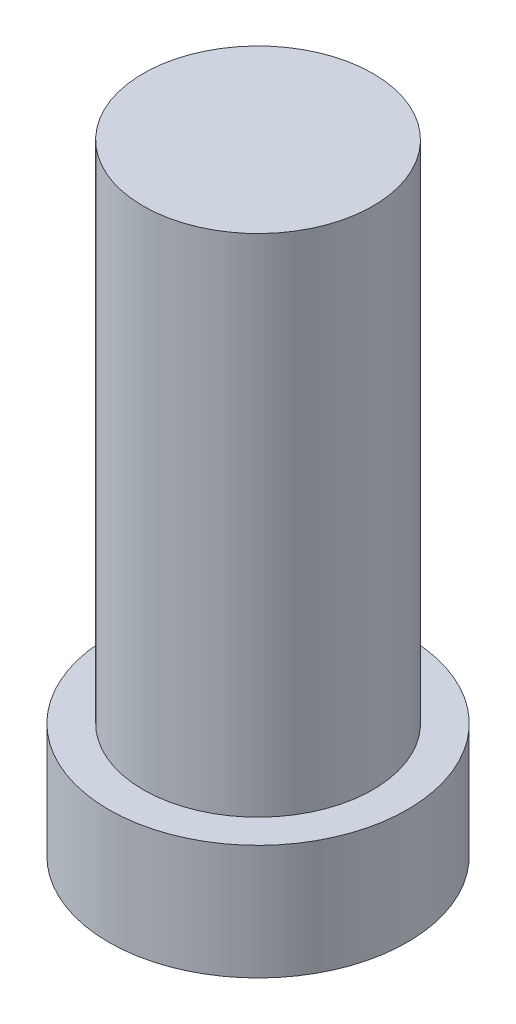
ISO-10303-21;
HEADER;
FILE_DESCRIPTION(('STEP AP214'),'2;1');
FILE_NAME('part.step','',(''),(''),'','','');
FILE_SCHEMA(('AUTOMOTIVE_DESIGN { 1 0 10303 214 1 1 1 1 }'));
ENDSEC;
DATA;
#1=APPLICATION_CONTEXT('core data for automotive mechanical design processes');
#2=APPLICATION_PROTOCOL_DEFINITION('international standard','automotive_design',2000,#1);
#3=PRODUCT_CONTEXT('',#1,'mechanical');
#4=PRODUCT('Part','Part','',(#3));
#5=PRODUCT_RELATED_PRODUCT_CATEGORY('part','',(#4));
#6=PRODUCT_DEFINITION_FORMATION('','',#4);
#7=PRODUCT_DEFINITION_CONTEXT('part definition',#1,'design');
#8=PRODUCT_DEFINITION('design','',#6,#7);
#9=PRODUCT_DEFINITION_SHAPE('','',#8);
#10=(LENGTH_UNIT() NAMED_UNIT(*) SI_UNIT(.MILLI.,.METRE.));
#11=(NAMED_UNIT(*) PLANE_ANGLE_UNIT() SI_UNIT($,.RADIAN.));
#12=(NAMED_UNIT(*) SI_UNIT($,.STERADIAN.) SOLID_ANGLE_UNIT());
#13=UNCERTAINTY_MEASURE_WITH_UNIT(LENGTH_MEASURE(1.E-05),#10,'distance_accuracy_value','');
#14=(GEOMETRIC_REPRESENTATION_CONTEXT(3) GLOBAL_UNCERTAINTY_ASSIGNED_CONTEXT((#13)) GLOBAL_UNIT_ASSIGNED_CONTEXT((#10,
#11,#12)) REPRESENTATION_CONTEXT('',''));
#15=CARTESIAN_POINT('',(0.,0.,0.));
#16=DIRECTION('',(0.,0.,1.));
#17=DIRECTION('',(1.,0.,0.));
#18=AXIS2_PLACEMENT_3D('',#15,#16,#17);
#19=CARTESIAN_POINT('',(0.,5.,0.));
#20=DIRECTION('',(0.,-1.,0.));
#21=DIRECTION('',(0.,0.,-1.));
#22=AXIS2_PLACEMENT_3D('',#19,#20,#21);
#23=CYLINDRICAL_SURFACE('',#22,6.5);
#24=CARTESIAN_POINT('',(0.,5.,0.));
#25=DIRECTION('',(0.,1.,0.));
#26=DIRECTION('',(0.,0.,1.));
#27=AXIS2_PLACEMENT_3D('',#24,#25,#26);
#28=CIRCLE('',#27,6.5);
#29=CARTESIAN_POINT('',(0.,5.,6.5));
#30=VERTEX_POINT('',#29);
#31=EDGE_CURVE('E49',#30,#30,#28,.T.);
#32=ORIENTED_EDGE('',*,*,#31,.F.);
#33=EDGE_LOOP('',(#32));
#34=FACE_BOUND('',#33,.T.);
#35=CARTESIAN_POINT('',(0.,0.,0.));
#36=DIRECTION('',(0.,1.,0.));
#37=DIRECTION('',(0.,0.,1.));
#38=AXIS2_PLACEMENT_3D('',#35,#36,#37);
#39=CIRCLE('',#38,6.5);
#40=CARTESIAN_POINT('',(0.,0.,6.5));
#41=VERTEX_POINT('',#40);
#42=EDGE_CURVE('E44',#41,#41,#39,.T.);
#43=ORIENTED_EDGE('',*,*,#42,.T.);
#44=EDGE_LOOP('',(#43));
#45=FACE_BOUND('',#44,.T.);
#46=ADVANCED_FACE('F41',(#34,#45),#23,.T.);
#47=CARTESIAN_POINT('',(0.,5.,0.));
#48=DIRECTION('',(0.,1.,0.));
#49=DIRECTION('',(0.,0.,1.));
#50=AXIS2_PLACEMENT_3D('',#47,#48,#49);
#51=PLANE('',#50);
#52=CARTESIAN_POINT('',(0.,5.,0.));
#53=DIRECTION('',(0.,1.,0.));
#54=DIRECTION('',(0.,0.,1.));
#55=AXIS2_PLACEMENT_3D('',#52,#53,#54);
#56=CIRCLE('',#55,5.);
#57=CARTESIAN_POINT('',(0.,5.,5.));
#58=VERTEX_POINT('',#57);
#59=EDGE_CURVE('E11',#58,#58,#56,.T.);
#60=ORIENTED_EDGE('',*,*,#59,.F.);
#61=EDGE_LOOP('',(#60));
#62=FACE_BOUND('',#61,.T.);
#63=ORIENTED_EDGE('',*,*,#31,.T.);
#64=EDGE_LOOP('',(#63));
#65=FACE_BOUND('',#64,.T.);
#66=ADVANCED_FACE('F132',(#62,#65),#51,.T.);
#67=CARTESIAN_POINT('',(0.,0.,0.));
#68=DIRECTION('',(0.,1.,0.));
#69=DIRECTION('',(0.,0.,1.));
#70=AXIS2_PLACEMENT_3D('',#67,#68,#69);
#71=PLANE('',#70);
#72=DIRECTION('',(-1.,0.,0.));
#73=VECTOR('',#72,1.);
#74=CARTESIAN_POINT('',(1.7667166355528,0.,5.1002659077454));
#75=LINE('',#74,#73);
#76=CARTESIAN_POINT('',(1.7667166355528,0.,5.1002659077454));
#77=VERTEX_POINT('',#76);
#78=CARTESIAN_POINT('',(-1.7667166355528,0.,5.1002659077454));
#79=VERTEX_POINT('',#78);
#80=EDGE_CURVE('E92',#77,#79,#75,.T.);
#81=ORIENTED_EDGE('',*,*,#80,.F.);
#82=DIRECTION('',(0.,0.,1.));
#83=VECTOR('',#82,1.);
#84=CARTESIAN_POINT('',(1.7667166355528,0.,-5.1002659077454));
#85=LINE('',#84,#83);
#86=CARTESIAN_POINT('',(1.7667166355528,0.,-5.1002659077454));
#87=VERTEX_POINT('',#86);
#88=EDGE_CURVE('E57',#87,#77,#85,.T.);
#89=ORIENTED_EDGE('',*,*,#88,.F.);
#90=DIRECTION('',(1.,0.,0.));
#91=VECTOR('',#90,1.);
#92=CARTESIAN_POINT('',(1.7667166355528,0.,-5.1002659077454));
#93=LINE('',#92,#91);
#94=CARTESIAN_POINT('',(-1.7667166355528,0.,-5.1002659077454));
#95=VERTEX_POINT('',#94);
#96=EDGE_CURVE('E108',#95,#87,#93,.T.);
#97=ORIENTED_EDGE('',*,*,#96,.F.);
#98=DIRECTION('',(0.,0.,-1.));
#99=VECTOR('',#98,1.);
#100=CARTESIAN_POINT('',(-1.7667166355528,0.,-5.1002659077454));
#101=LINE('',#100,#99);
#102=EDGE_CURVE('E114',#79,#95,#101,.T.);
#103=ORIENTED_EDGE('',*,*,#102,.F.);
#104=EDGE_LOOP('',(#81,#89,#97,#103));
#105=FACE_BOUND('',#104,.T.);
#106=ORIENTED_EDGE('',*,*,#42,.F.);
#107=EDGE_LOOP('',(#106));
#108=FACE_BOUND('',#107,.T.);
#109=ADVANCED_FACE('F129',(#105,#108),#71,.F.);
#110=CARTESIAN_POINT('',(0.,27.,0.));
#111=DIRECTION('',(0.,-1.,0.));
#112=DIRECTION('',(0.,0.,-1.));
#113=AXIS2_PLACEMENT_3D('',#110,#111,#112);
#114=CYLINDRICAL_SURFACE('',#113,5.);
#115=CARTESIAN_POINT('',(0.,27.,0.));
#116=DIRECTION('',(0.,1.,0.));
#117=DIRECTION('',(0.,0.,1.));
#118=AXIS2_PLACEMENT_3D('',#115,#116,#117);
#119=CIRCLE('',#118,5.);
#120=CARTESIAN_POINT('',(0.,27.,5.));
#121=VERTEX_POINT('',#120);
#122=EDGE_CURVE('E118',#121,#121,#119,.T.);
#123=ORIENTED_EDGE('',*,*,#122,.F.);
#124=EDGE_LOOP('',(#123));
#125=FACE_BOUND('',#124,.T.);
#126=ORIENTED_EDGE('',*,*,#59,.T.);
#127=EDGE_LOOP('',(#126));
#128=FACE_BOUND('',#127,.T.);
#129=ADVANCED_FACE('F131',(#125,#128),#114,.T.);
#130=CARTESIAN_POINT('',(0.,27.,0.));
#131=DIRECTION('',(0.,1.,0.));
#132=DIRECTION('',(0.,0.,1.));
#133=AXIS2_PLACEMENT_3D('',#130,#131,#132);
#134=PLANE('',#133);
#135=ORIENTED_EDGE('',*,*,#122,.T.);
#136=EDGE_LOOP('',(#135));
#137=FACE_BOUND('',#136,.T.);
#138=ADVANCED_FACE('F139',(#137),#134,.T.);
#139=CARTESIAN_POINT('',(1.7667166355528,3.,-5.1002659077454));
#140=DIRECTION('',(1.,0.,0.));
#141=DIRECTION('',(0.,0.,-1.));
#142=AXIS2_PLACEMENT_3D('',#139,#140,#141);
#143=PLANE('',#142);
#144=ORIENTED_EDGE('',*,*,#88,.T.);
#145=DIRECTION('',(0.,-1.,0.));
#146=VECTOR('',#145,1.);
#147=CARTESIAN_POINT('',(1.7667166355528,3.,5.1002659077454));
#148=LINE('',#147,#146);
#149=CARTESIAN_POINT('',(1.7667166355528,3.,5.1002659077454));
#150=VERTEX_POINT('',#149);
#151=EDGE_CURVE('E80',#150,#77,#148,.T.);
#152=ORIENTED_EDGE('',*,*,#151,.F.);
#153=DIRECTION('',(0.,0.,1.));
#154=VECTOR('',#153,1.);
#155=CARTESIAN_POINT('',(1.7667166355528,3.,-5.1002659077454));
#156=LINE('',#155,#154);
#157=CARTESIAN_POINT('',(1.7667166355528,3.,-5.1002659077454));
#158=VERTEX_POINT('',#157);
#159=EDGE_CURVE('E106',#158,#150,#156,.T.);
#160=ORIENTED_EDGE('',*,*,#159,.F.);
#161=DIRECTION('',(0.,-1.,0.));
#162=VECTOR('',#161,1.);
#163=CARTESIAN_POINT('',(1.7667166355528,3.,-5.1002659077454));
#164=LINE('',#163,#162);
#165=EDGE_CURVE('E65',#158,#87,#164,.T.);
#166=ORIENTED_EDGE('',*,*,#165,.T.);
#167=EDGE_LOOP('',(#144,#152,#160,#166));
#168=FACE_BOUND('',#167,.T.);
#169=ADVANCED_FACE('F168',(#168),#143,.F.);
#170=CARTESIAN_POINT('',(1.7667166355528,3.,-5.1002659077454));
#171=DIRECTION('',(0.,0.,-1.));
#172=DIRECTION('',(-1.,0.,0.));
#173=AXIS2_PLACEMENT_3D('',#170,#171,#172);
#174=PLANE('',#173);
#175=ORIENTED_EDGE('',*,*,#96,.T.);
#176=ORIENTED_EDGE('',*,*,#165,.F.);
#177=DIRECTION('',(1.,0.,0.));
#178=VECTOR('',#177,1.);
#179=CARTESIAN_POINT('',(1.7667166355528,3.,-5.1002659077454));
#180=LINE('',#179,#178);
#181=CARTESIAN_POINT('',(-1.7667166355528,3.,-5.1002659077454));
#182=VERTEX_POINT('',#181);
#183=EDGE_CURVE('E103',#182,#158,#180,.T.);
#184=ORIENTED_EDGE('',*,*,#183,.F.);
#185=DIRECTION('',(0.,-1.,0.));
#186=VECTOR('',#185,1.);
#187=CARTESIAN_POINT('',(-1.7667166355528,3.,-5.1002659077454));
#188=LINE('',#187,#186);
#189=EDGE_CURVE('E96',#182,#95,#188,.T.);
#190=ORIENTED_EDGE('',*,*,#189,.T.);
#191=EDGE_LOOP('',(#175,#176,#184,#190));
#192=FACE_BOUND('',#191,.T.);
#193=ADVANCED_FACE('F175',(#192),#174,.F.);
#194=CARTESIAN_POINT('',(-1.7667166355528,3.,-5.1002659077454));
#195=DIRECTION('',(-1.,0.,0.));
#196=DIRECTION('',(0.,0.,1.));
#197=AXIS2_PLACEMENT_3D('',#194,#195,#196);
#198=PLANE('',#197);
#199=ORIENTED_EDGE('',*,*,#102,.T.);
#200=ORIENTED_EDGE('',*,*,#189,.F.);
#201=DIRECTION('',(0.,0.,-1.));
#202=VECTOR('',#201,1.);
#203=CARTESIAN_POINT('',(-1.7667166355528,3.,-5.1002659077454));
#204=LINE('',#203,#202);
#205=CARTESIAN_POINT('',(-1.7667166355528,3.,5.1002659077454));
#206=VERTEX_POINT('',#205);
#207=EDGE_CURVE('E99',#206,#182,#204,.T.);
#208=ORIENTED_EDGE('',*,*,#207,.F.);
#209=DIRECTION('',(0.,-1.,0.));
#210=VECTOR('',#209,1.);
#211=CARTESIAN_POINT('',(-1.7667166355528,3.,5.1002659077454));
#212=LINE('',#211,#210);
#213=EDGE_CURVE('E85',#206,#79,#212,.T.);
#214=ORIENTED_EDGE('',*,*,#213,.T.);
#215=EDGE_LOOP('',(#199,#200,#208,#214));
#216=FACE_BOUND('',#215,.T.);
#217=ADVANCED_FACE('F100',(#216),#198,.F.);
#218=CARTESIAN_POINT('',(1.7667166355528,3.,5.1002659077454));
#219=DIRECTION('',(0.,0.,1.));
#220=DIRECTION('',(1.,0.,0.));
#221=AXIS2_PLACEMENT_3D('',#218,#219,#220);
#222=PLANE('',#221);
#223=ORIENTED_EDGE('',*,*,#80,.T.);
#224=ORIENTED_EDGE('',*,*,#213,.F.);
#225=DIRECTION('',(-1.,0.,0.));
#226=VECTOR('',#225,1.);
#227=CARTESIAN_POINT('',(1.7667166355528,3.,5.1002659077454));
#228=LINE('',#227,#226);
#229=EDGE_CURVE('E89',#150,#206,#228,.T.);
#230=ORIENTED_EDGE('',*,*,#229,.F.);
#231=ORIENTED_EDGE('',*,*,#151,.T.);
#232=EDGE_LOOP('',(#223,#224,#230,#231));
#233=FACE_BOUND('',#232,.T.);
#234=ADVANCED_FACE('F87',(#233),#222,.F.);
#235=CARTESIAN_POINT('',(0.,3.,0.));
#236=DIRECTION('',(0.,-1.,0.));
#237=DIRECTION('',(0.,0.,-1.));
#238=AXIS2_PLACEMENT_3D('',#235,#236,#237);
#239=PLANE('',#238);
#240=ORIENTED_EDGE('',*,*,#159,.T.);
#241=ORIENTED_EDGE('',*,*,#229,.T.);
#242=ORIENTED_EDGE('',*,*,#207,.T.);
#243=ORIENTED_EDGE('',*,*,#183,.T.);
#244=EDGE_LOOP('',(#240,#241,#242,#243));
#245=FACE_BOUND('',#244,.T.);
#246=ADVANCED_FACE('F105',(#245),#239,.T.);
#247=CLOSED_SHELL('',(#46,#66,#109,#129,#138,#169,#193,#217,#234,#246));
#248=MANIFOLD_SOLID_BREP('B2',#247);
#249=ADVANCED_BREP_SHAPE_REPRESENTATION('',(#18,#248),#14);
#250=SHAPE_DEFINITION_REPRESENTATION(#9,#249);
ENDSEC;
END-ISO-10303-21;
